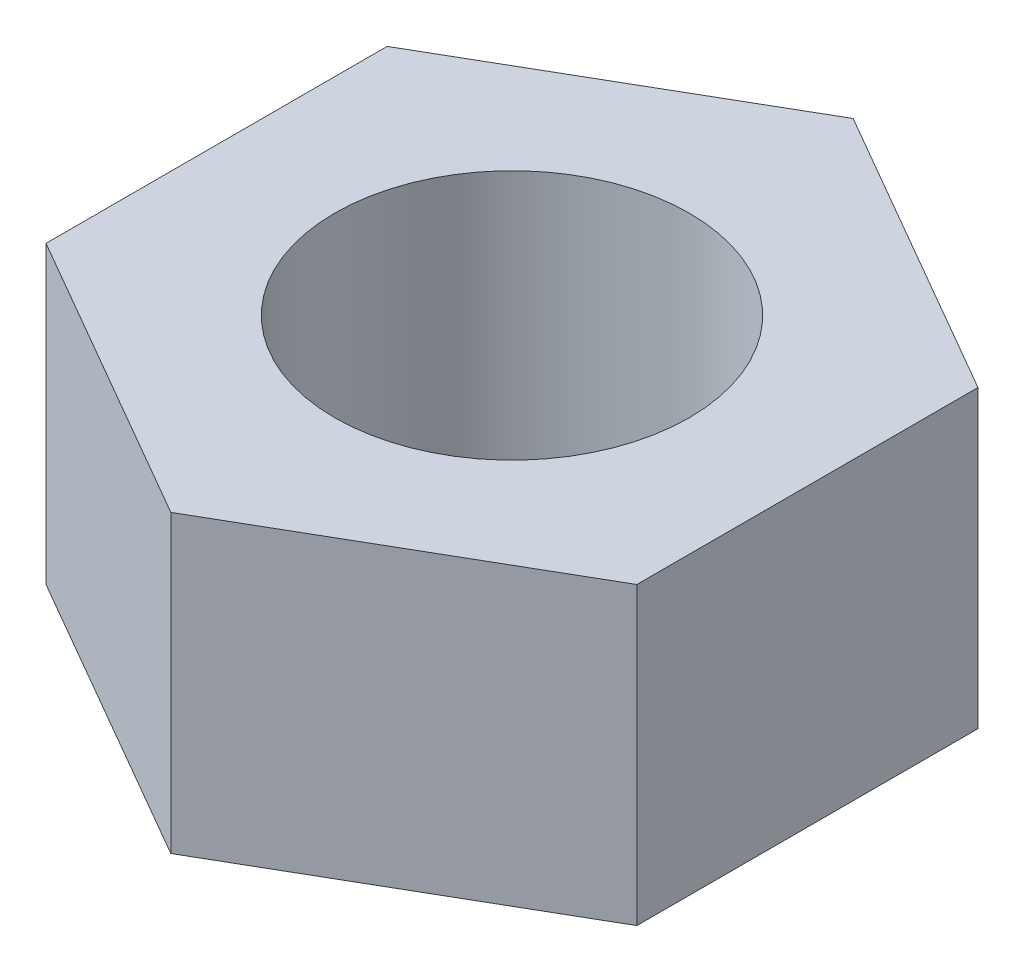
ISO-10303-21;
HEADER;
FILE_DESCRIPTION(('STEP AP214'),'2;1');
FILE_NAME('part.step','',(''),(''),'','','');
FILE_SCHEMA(('AUTOMOTIVE_DESIGN { 1 0 10303 214 1 1 1 1 }'));
ENDSEC;
DATA;
#1=APPLICATION_CONTEXT('core data for automotive mechanical design processes');
#2=APPLICATION_PROTOCOL_DEFINITION('international standard','automotive_design',2000,#1);
#3=PRODUCT_CONTEXT('',#1,'mechanical');
#4=PRODUCT('Part','Part','',(#3));
#5=PRODUCT_RELATED_PRODUCT_CATEGORY('part','',(#4));
#6=PRODUCT_DEFINITION_FORMATION('','',#4);
#7=PRODUCT_DEFINITION_CONTEXT('part definition',#1,'design');
#8=PRODUCT_DEFINITION('design','',#6,#7);
#9=PRODUCT_DEFINITION_SHAPE('','',#8);
#10=(LENGTH_UNIT() NAMED_UNIT(*) SI_UNIT(.MILLI.,.METRE.));
#11=(NAMED_UNIT(*) PLANE_ANGLE_UNIT() SI_UNIT($,.RADIAN.));
#12=(NAMED_UNIT(*) SI_UNIT($,.STERADIAN.) SOLID_ANGLE_UNIT());
#13=UNCERTAINTY_MEASURE_WITH_UNIT(LENGTH_MEASURE(1.E-05),#10,'distance_accuracy_value','');
#14=(GEOMETRIC_REPRESENTATION_CONTEXT(3) GLOBAL_UNCERTAINTY_ASSIGNED_CONTEXT((#13)) GLOBAL_UNIT_ASSIGNED_CONTEXT((#10,
#11,#12)) REPRESENTATION_CONTEXT('',''));
#15=CARTESIAN_POINT('',(0.,0.,0.));
#16=DIRECTION('',(0.,0.,1.));
#17=DIRECTION('',(1.,0.,0.));
#18=AXIS2_PLACEMENT_3D('',#15,#16,#17);
#19=CARTESIAN_POINT('',(2.49999999999998,2.5,-1.44337567297409));
#20=DIRECTION('',(-0.499999999999995,0.,0.866025403784442));
#21=DIRECTION('',(0.866025403784442,0.,0.499999999999995));
#22=AXIS2_PLACEMENT_3D('',#19,#20,#21);
#23=PLANE('',#22);
#24=DIRECTION('',(-0.866025403784441,0.,-0.499999999999995));
#25=VECTOR('',#24,1.);
#26=CARTESIAN_POINT('',(2.49999999999998,0.,-1.44337567297409));
#27=LINE('',#26,#25);
#28=CARTESIAN_POINT('',(2.49999999999998,0.,-1.44337567297409));
#29=VERTEX_POINT('',#28);
#30=CARTESIAN_POINT('',(0.,0.,-2.88675134594813));
#31=VERTEX_POINT('',#30);
#32=EDGE_CURVE('E116',#29,#31,#27,.T.);
#33=ORIENTED_EDGE('',*,*,#32,.T.);
#34=DIRECTION('',(0.,-1.,0.));
#35=VECTOR('',#34,1.);
#36=CARTESIAN_POINT('',(0.,2.5,-2.88675134594813));
#37=LINE('',#36,#35);
#38=CARTESIAN_POINT('',(0.,2.5,-2.88675134594813));
#39=VERTEX_POINT('',#38);
#40=EDGE_CURVE('E11',#39,#31,#37,.T.);
#41=ORIENTED_EDGE('',*,*,#40,.F.);
#42=DIRECTION('',(-0.866025403784441,0.,-0.499999999999995));
#43=VECTOR('',#42,1.);
#44=CARTESIAN_POINT('',(2.49999999999998,2.5,-1.44337567297409));
#45=LINE('',#44,#43);
#46=CARTESIAN_POINT('',(2.49999999999998,2.5,-1.44337567297409));
#47=VERTEX_POINT('',#46);
#48=EDGE_CURVE('E127',#47,#39,#45,.T.);
#49=ORIENTED_EDGE('',*,*,#48,.F.);
#50=DIRECTION('',(0.,-1.,0.));
#51=VECTOR('',#50,1.);
#52=CARTESIAN_POINT('',(2.49999999999998,2.5,-1.44337567297409));
#53=LINE('',#52,#51);
#54=EDGE_CURVE('E112',#47,#29,#53,.T.);
#55=ORIENTED_EDGE('',*,*,#54,.T.);
#56=EDGE_LOOP('',(#33,#41,#49,#55));
#57=FACE_BOUND('',#56,.T.);
#58=ADVANCED_FACE('F32',(#57),#23,.F.);
#59=CARTESIAN_POINT('',(0.,2.5,-2.88675134594813));
#60=DIRECTION('',(0.500000000000001,0.,0.866025403784438));
#61=DIRECTION('',(0.866025403784438,0.,-0.500000000000001));
#62=AXIS2_PLACEMENT_3D('',#59,#60,#61);
#63=PLANE('',#62);
#64=DIRECTION('',(-0.866025403784438,0.,0.500000000000001));
#65=VECTOR('',#64,1.);
#66=CARTESIAN_POINT('',(0.,0.,-2.88675134594813));
#67=LINE('',#66,#65);
#68=CARTESIAN_POINT('',(-2.5,0.,-1.44337567297406));
#69=VERTEX_POINT('',#68);
#70=EDGE_CURVE('E119',#31,#69,#67,.T.);
#71=ORIENTED_EDGE('',*,*,#70,.T.);
#72=DIRECTION('',(0.,-1.,0.));
#73=VECTOR('',#72,1.);
#74=CARTESIAN_POINT('',(-2.5,2.5,-1.44337567297406));
#75=LINE('',#74,#73);
#76=CARTESIAN_POINT('',(-2.5,2.5,-1.44337567297406));
#77=VERTEX_POINT('',#76);
#78=EDGE_CURVE('E40',#77,#69,#75,.T.);
#79=ORIENTED_EDGE('',*,*,#78,.F.);
#80=DIRECTION('',(-0.866025403784438,0.,0.500000000000001));
#81=VECTOR('',#80,1.);
#82=CARTESIAN_POINT('',(0.,2.5,-2.88675134594813));
#83=LINE('',#82,#81);
#84=EDGE_CURVE('E85',#39,#77,#83,.T.);
#85=ORIENTED_EDGE('',*,*,#84,.F.);
#86=ORIENTED_EDGE('',*,*,#40,.T.);
#87=EDGE_LOOP('',(#71,#79,#85,#86));
#88=FACE_BOUND('',#87,.T.);
#89=ADVANCED_FACE('F152',(#88),#63,.F.);
#90=CARTESIAN_POINT('',(-2.5,2.5,-1.44337567297406));
#91=DIRECTION('',(1.,0.,0.));
#92=DIRECTION('',(0.,0.,-1.));
#93=AXIS2_PLACEMENT_3D('',#90,#91,#92);
#94=PLANE('',#93);
#95=DIRECTION('',(0.,0.,1.));
#96=VECTOR('',#95,1.);
#97=CARTESIAN_POINT('',(-2.5,0.,-1.44337567297406));
#98=LINE('',#97,#96);
#99=CARTESIAN_POINT('',(-2.49999999999999,0.,1.44337567297407));
#100=VERTEX_POINT('',#99);
#101=EDGE_CURVE('E122',#69,#100,#98,.T.);
#102=ORIENTED_EDGE('',*,*,#101,.T.);
#103=DIRECTION('',(0.,-1.,0.));
#104=VECTOR('',#103,1.);
#105=CARTESIAN_POINT('',(-2.49999999999999,2.5,1.44337567297407));
#106=LINE('',#105,#104);
#107=CARTESIAN_POINT('',(-2.49999999999999,2.5,1.44337567297407));
#108=VERTEX_POINT('',#107);
#109=EDGE_CURVE('E107',#108,#100,#106,.T.);
#110=ORIENTED_EDGE('',*,*,#109,.F.);
#111=DIRECTION('',(0.,0.,1.));
#112=VECTOR('',#111,1.);
#113=CARTESIAN_POINT('',(-2.5,2.5,-1.44337567297406));
#114=LINE('',#113,#112);
#115=EDGE_CURVE('E98',#77,#108,#114,.T.);
#116=ORIENTED_EDGE('',*,*,#115,.F.);
#117=ORIENTED_EDGE('',*,*,#78,.T.);
#118=EDGE_LOOP('',(#102,#110,#116,#117));
#119=FACE_BOUND('',#118,.T.);
#120=ADVANCED_FACE('F133',(#119),#94,.F.);
#121=CARTESIAN_POINT('',(-2.49999999999999,2.5,1.44337567297407));
#122=DIRECTION('',(0.499999999999995,0.,-0.866025403784442));
#123=DIRECTION('',(-0.866025403784442,0.,-0.499999999999995));
#124=AXIS2_PLACEMENT_3D('',#121,#122,#123);
#125=PLANE('',#124);
#126=DIRECTION('',(0.866025403784441,0.,0.499999999999995));
#127=VECTOR('',#126,1.);
#128=CARTESIAN_POINT('',(-2.49999999999999,0.,1.44337567297407));
#129=LINE('',#128,#127);
#130=CARTESIAN_POINT('',(0.,0.,2.88675134594813));
#131=VERTEX_POINT('',#130);
#132=EDGE_CURVE('E106',#100,#131,#129,.T.);
#133=ORIENTED_EDGE('',*,*,#132,.T.);
#134=DIRECTION('',(0.,-1.,0.));
#135=VECTOR('',#134,1.);
#136=CARTESIAN_POINT('',(0.,2.5,2.88675134594813));
#137=LINE('',#136,#135);
#138=CARTESIAN_POINT('',(0.,2.5,2.88675134594813));
#139=VERTEX_POINT('',#138);
#140=EDGE_CURVE('E103',#139,#131,#137,.T.);
#141=ORIENTED_EDGE('',*,*,#140,.F.);
#142=DIRECTION('',(0.866025403784441,0.,0.499999999999995));
#143=VECTOR('',#142,1.);
#144=CARTESIAN_POINT('',(-2.49999999999999,2.5,1.44337567297407));
#145=LINE('',#144,#143);
#146=EDGE_CURVE('E92',#108,#139,#145,.T.);
#147=ORIENTED_EDGE('',*,*,#146,.F.);
#148=ORIENTED_EDGE('',*,*,#109,.T.);
#149=EDGE_LOOP('',(#133,#141,#147,#148));
#150=FACE_BOUND('',#149,.T.);
#151=ADVANCED_FACE('F104',(#150),#125,.F.);
#152=CARTESIAN_POINT('',(0.,2.5,2.88675134594813));
#153=DIRECTION('',(-0.500000000000007,0.,-0.866025403784435));
#154=DIRECTION('',(-0.866025403784435,0.,0.500000000000007));
#155=AXIS2_PLACEMENT_3D('',#152,#153,#154);
#156=PLANE('',#155);
#157=DIRECTION('',(0.866025403784434,0.,-0.500000000000007));
#158=VECTOR('',#157,1.);
#159=CARTESIAN_POINT('',(0.,0.,2.88675134594813));
#160=LINE('',#159,#158);
#161=CARTESIAN_POINT('',(2.50000000000001,0.,1.44337567297404));
#162=VERTEX_POINT('',#161);
#163=EDGE_CURVE('E71',#131,#162,#160,.T.);
#164=ORIENTED_EDGE('',*,*,#163,.T.);
#165=DIRECTION('',(0.,-1.,0.));
#166=VECTOR('',#165,1.);
#167=CARTESIAN_POINT('',(2.50000000000001,2.5,1.44337567297404));
#168=LINE('',#167,#166);
#169=CARTESIAN_POINT('',(2.50000000000001,2.5,1.44337567297404));
#170=VERTEX_POINT('',#169);
#171=EDGE_CURVE('E108',#170,#162,#168,.T.);
#172=ORIENTED_EDGE('',*,*,#171,.F.);
#173=DIRECTION('',(0.866025403784434,0.,-0.500000000000007));
#174=VECTOR('',#173,1.);
#175=CARTESIAN_POINT('',(0.,2.5,2.88675134594813));
#176=LINE('',#175,#174);
#177=EDGE_CURVE('E96',#139,#170,#176,.T.);
#178=ORIENTED_EDGE('',*,*,#177,.F.);
#179=ORIENTED_EDGE('',*,*,#140,.T.);
#180=EDGE_LOOP('',(#164,#172,#178,#179));
#181=FACE_BOUND('',#180,.T.);
#182=ADVANCED_FACE('F110',(#181),#156,.F.);
#183=CARTESIAN_POINT('',(2.50000000000001,2.5,1.44337567297404));
#184=DIRECTION('',(-1.,0.,0.));
#185=DIRECTION('',(0.,0.,1.));
#186=AXIS2_PLACEMENT_3D('',#183,#184,#185);
#187=PLANE('',#186);
#188=DIRECTION('',(0.,0.,-1.));
#189=VECTOR('',#188,1.);
#190=CARTESIAN_POINT('',(2.50000000000001,0.,1.44337567297404));
#191=LINE('',#190,#189);
#192=EDGE_CURVE('E77',#162,#29,#191,.T.);
#193=ORIENTED_EDGE('',*,*,#192,.T.);
#194=ORIENTED_EDGE('',*,*,#54,.F.);
#195=DIRECTION('',(0.,0.,-1.));
#196=VECTOR('',#195,1.);
#197=CARTESIAN_POINT('',(2.50000000000001,2.5,1.44337567297404));
#198=LINE('',#197,#196);
#199=EDGE_CURVE('E48',#170,#47,#198,.T.);
#200=ORIENTED_EDGE('',*,*,#199,.F.);
#201=ORIENTED_EDGE('',*,*,#171,.T.);
#202=EDGE_LOOP('',(#193,#194,#200,#201));
#203=FACE_BOUND('',#202,.T.);
#204=ADVANCED_FACE('F140',(#203),#187,.F.);
#205=CARTESIAN_POINT('',(0.,2.5,0.));
#206=DIRECTION('',(0.,1.,0.));
#207=DIRECTION('',(0.,0.,1.));
#208=AXIS2_PLACEMENT_3D('',#205,#206,#207);
#209=PLANE('',#208);
#210=CARTESIAN_POINT('',(0.,2.5,0.));
#211=DIRECTION('',(0.,1.,0.));
#212=DIRECTION('',(0.,0.,1.));
#213=AXIS2_PLACEMENT_3D('',#210,#211,#212);
#214=CIRCLE('',#213,1.5);
#215=CARTESIAN_POINT('',(0.,2.5,1.5));
#216=VERTEX_POINT('',#215);
#217=EDGE_CURVE('E207',#216,#216,#214,.T.);
#218=ORIENTED_EDGE('',*,*,#217,.F.);
#219=EDGE_LOOP('',(#218));
#220=FACE_BOUND('',#219,.T.);
#221=ORIENTED_EDGE('',*,*,#48,.T.);
#222=ORIENTED_EDGE('',*,*,#84,.T.);
#223=ORIENTED_EDGE('',*,*,#115,.T.);
#224=ORIENTED_EDGE('',*,*,#146,.T.);
#225=ORIENTED_EDGE('',*,*,#177,.T.);
#226=ORIENTED_EDGE('',*,*,#199,.T.);
#227=EDGE_LOOP('',(#221,#222,#223,#224,#225,#226));
#228=FACE_BOUND('',#227,.T.);
#229=ADVANCED_FACE('F94',(#220,#228),#209,.T.);
#230=CARTESIAN_POINT('',(0.,0.,0.));
#231=DIRECTION('',(0.,1.,0.));
#232=DIRECTION('',(0.,0.,1.));
#233=AXIS2_PLACEMENT_3D('',#230,#231,#232);
#234=PLANE('',#233);
#235=CARTESIAN_POINT('',(0.,0.,0.));
#236=DIRECTION('',(0.,1.,0.));
#237=DIRECTION('',(0.,0.,1.));
#238=AXIS2_PLACEMENT_3D('',#235,#236,#237);
#239=CIRCLE('',#238,1.5);
#240=CARTESIAN_POINT('',(0.,0.,1.5));
#241=VERTEX_POINT('',#240);
#242=EDGE_CURVE('E120',#241,#241,#239,.T.);
#243=ORIENTED_EDGE('',*,*,#242,.T.);
#244=EDGE_LOOP('',(#243));
#245=FACE_BOUND('',#244,.T.);
#246=ORIENTED_EDGE('',*,*,#32,.F.);
#247=ORIENTED_EDGE('',*,*,#192,.F.);
#248=ORIENTED_EDGE('',*,*,#163,.F.);
#249=ORIENTED_EDGE('',*,*,#132,.F.);
#250=ORIENTED_EDGE('',*,*,#101,.F.);
#251=ORIENTED_EDGE('',*,*,#70,.F.);
#252=EDGE_LOOP('',(#246,#247,#248,#249,#250,#251));
#253=FACE_BOUND('',#252,.T.);
#254=ADVANCED_FACE('F136',(#245,#253),#234,.F.);
#255=CARTESIAN_POINT('',(0.,0.,0.));
#256=DIRECTION('',(0.,1.,0.));
#257=DIRECTION('',(0.,0.,1.));
#258=AXIS2_PLACEMENT_3D('',#255,#256,#257);
#259=CYLINDRICAL_SURFACE('',#258,1.5);
#260=ORIENTED_EDGE('',*,*,#242,.F.);
#261=EDGE_LOOP('',(#260));
#262=FACE_BOUND('',#261,.T.);
#263=ORIENTED_EDGE('',*,*,#217,.T.);
#264=EDGE_LOOP('',(#263));
#265=FACE_BOUND('',#264,.T.);
#266=ADVANCED_FACE('F189',(#262,#265),#259,.F.);
#267=CLOSED_SHELL('',(#58,#89,#120,#151,#182,#204,#229,#254,#266));
#268=MANIFOLD_SOLID_BREP('B2',#267);
#269=ADVANCED_BREP_SHAPE_REPRESENTATION('',(#18,#268),#14);
#270=SHAPE_DEFINITION_REPRESENTATION(#9,#269);
ENDSEC;
END-ISO-10303-21;
